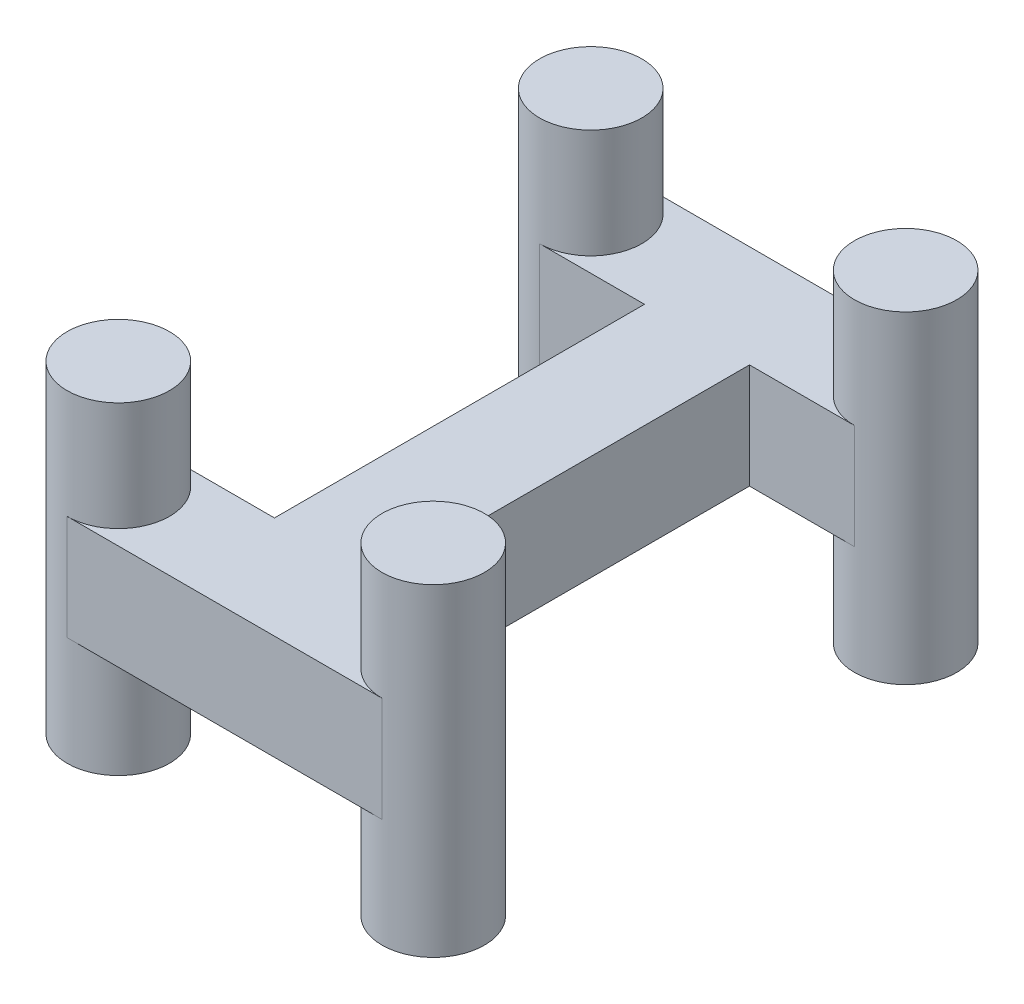
ISO-10303-21;
HEADER;
FILE_DESCRIPTION(('STEP AP214'),'2;1');
FILE_NAME('part.step','',(''),(''),'','','');
FILE_SCHEMA(('AUTOMOTIVE_DESIGN { 1 0 10303 214 1 1 1 1 }'));
ENDSEC;
DATA;
#1=APPLICATION_CONTEXT('core data for automotive mechanical design processes');
#2=APPLICATION_PROTOCOL_DEFINITION('international standard','automotive_design',2000,#1);
#3=PRODUCT_CONTEXT('',#1,'mechanical');
#4=PRODUCT('Part','Part','',(#3));
#5=PRODUCT_RELATED_PRODUCT_CATEGORY('part','',(#4));
#6=PRODUCT_DEFINITION_FORMATION('','',#4);
#7=PRODUCT_DEFINITION_CONTEXT('part definition',#1,'design');
#8=PRODUCT_DEFINITION('design','',#6,#7);
#9=PRODUCT_DEFINITION_SHAPE('','',#8);
#10=(LENGTH_UNIT() NAMED_UNIT(*) SI_UNIT(.MILLI.,.METRE.));
#11=(NAMED_UNIT(*) PLANE_ANGLE_UNIT() SI_UNIT($,.RADIAN.));
#12=(NAMED_UNIT(*) SI_UNIT($,.STERADIAN.) SOLID_ANGLE_UNIT());
#13=UNCERTAINTY_MEASURE_WITH_UNIT(LENGTH_MEASURE(1.E-05),#10,'distance_accuracy_value','');
#14=(GEOMETRIC_REPRESENTATION_CONTEXT(3) GLOBAL_UNCERTAINTY_ASSIGNED_CONTEXT((#13)) GLOBAL_UNIT_ASSIGNED_CONTEXT((#10,
#11,#12)) REPRESENTATION_CONTEXT('',''));
#15=CARTESIAN_POINT('',(0.,0.,0.));
#16=DIRECTION('',(0.,0.,1.));
#17=DIRECTION('',(1.,0.,0.));
#18=AXIS2_PLACEMENT_3D('',#15,#16,#17);
#19=CARTESIAN_POINT('',(0.,-2.,7.05));
#20=DIRECTION('',(0.,0.,-1.));
#21=DIRECTION('',(-1.,0.,0.));
#22=AXIS2_PLACEMENT_3D('',#19,#20,#21);
#23=PLANE('',#22);
#24=DIRECTION('',(0.,1.,0.));
#25=VECTOR('',#24,1.);
#26=CARTESIAN_POINT('',(-6.,-2.,7.05));
#27=LINE('',#26,#25);
#28=CARTESIAN_POINT('',(-6.,-2.,7.05));
#29=VERTEX_POINT('',#28);
#30=CARTESIAN_POINT('',(-6.,2.,7.05));
#31=VERTEX_POINT('',#30);
#32=EDGE_CURVE('E11',#29,#31,#27,.T.);
#33=ORIENTED_EDGE('',*,*,#32,.T.);
#34=DIRECTION('',(-1.,0.,0.));
#35=VECTOR('',#34,1.);
#36=CARTESIAN_POINT('',(0.,2.,7.05));
#37=LINE('',#36,#35);
#38=CARTESIAN_POINT('',(-2.,2.,7.05));
#39=VERTEX_POINT('',#38);
#40=EDGE_CURVE('E189',#39,#31,#37,.T.);
#41=ORIENTED_EDGE('',*,*,#40,.F.);
#42=DIRECTION('',(0.,1.,0.));
#43=VECTOR('',#42,1.);
#44=CARTESIAN_POINT('',(-2.,-2.,7.05));
#45=LINE('',#44,#43);
#46=CARTESIAN_POINT('',(-2.,-2.,7.05));
#47=VERTEX_POINT('',#46);
#48=EDGE_CURVE('E51',#47,#39,#45,.T.);
#49=ORIENTED_EDGE('',*,*,#48,.F.);
#50=DIRECTION('',(-1.,0.,0.));
#51=VECTOR('',#50,1.);
#52=CARTESIAN_POINT('',(0.,-2.,7.05));
#53=LINE('',#52,#51);
#54=EDGE_CURVE('E228',#47,#29,#53,.T.);
#55=ORIENTED_EDGE('',*,*,#54,.T.);
#56=EDGE_LOOP('',(#33,#41,#49,#55));
#57=FACE_BOUND('',#56,.T.);
#58=ADVANCED_FACE('F41',(#57),#23,.T.);
#59=CARTESIAN_POINT('',(-2.,-2.,0.));
#60=DIRECTION('',(-1.,0.,0.));
#61=DIRECTION('',(0.,0.,1.));
#62=AXIS2_PLACEMENT_3D('',#59,#60,#61);
#63=PLANE('',#62);
#64=ORIENTED_EDGE('',*,*,#48,.T.);
#65=DIRECTION('',(0.,0.,1.));
#66=VECTOR('',#65,1.);
#67=CARTESIAN_POINT('',(-2.,2.,0.));
#68=LINE('',#67,#66);
#69=CARTESIAN_POINT('',(-2.,2.,-7.05));
#70=VERTEX_POINT('',#69);
#71=EDGE_CURVE('E185',#70,#39,#68,.T.);
#72=ORIENTED_EDGE('',*,*,#71,.F.);
#73=DIRECTION('',(0.,1.,0.));
#74=VECTOR('',#73,1.);
#75=CARTESIAN_POINT('',(-2.,-2.,-7.05));
#76=LINE('',#75,#74);
#77=CARTESIAN_POINT('',(-2.,-2.,-7.05));
#78=VERTEX_POINT('',#77);
#79=EDGE_CURVE('E233',#78,#70,#76,.T.);
#80=ORIENTED_EDGE('',*,*,#79,.F.);
#81=DIRECTION('',(0.,0.,1.));
#82=VECTOR('',#81,1.);
#83=CARTESIAN_POINT('',(-2.,-2.,0.));
#84=LINE('',#83,#82);
#85=EDGE_CURVE('E225',#78,#47,#84,.T.);
#86=ORIENTED_EDGE('',*,*,#85,.T.);
#87=EDGE_LOOP('',(#64,#72,#80,#86));
#88=FACE_BOUND('',#87,.T.);
#89=ADVANCED_FACE('F293',(#88),#63,.T.);
#90=CARTESIAN_POINT('',(0.,-2.,-7.05));
#91=DIRECTION('',(0.,0.,1.));
#92=DIRECTION('',(1.,0.,0.));
#93=AXIS2_PLACEMENT_3D('',#90,#91,#92);
#94=PLANE('',#93);
#95=ORIENTED_EDGE('',*,*,#79,.T.);
#96=DIRECTION('',(1.,0.,0.));
#97=VECTOR('',#96,1.);
#98=CARTESIAN_POINT('',(0.,2.,-7.05));
#99=LINE('',#98,#97);
#100=CARTESIAN_POINT('',(-6.,2.,-7.05));
#101=VERTEX_POINT('',#100);
#102=EDGE_CURVE('E181',#101,#70,#99,.T.);
#103=ORIENTED_EDGE('',*,*,#102,.F.);
#104=DIRECTION('',(0.,1.,0.));
#105=VECTOR('',#104,1.);
#106=CARTESIAN_POINT('',(-6.,-2.,-7.05));
#107=LINE('',#106,#105);
#108=CARTESIAN_POINT('',(-6.,-2.,-7.05));
#109=VERTEX_POINT('',#108);
#110=EDGE_CURVE('E236',#109,#101,#107,.T.);
#111=ORIENTED_EDGE('',*,*,#110,.F.);
#112=DIRECTION('',(1.,0.,0.));
#113=VECTOR('',#112,1.);
#114=CARTESIAN_POINT('',(0.,-2.,-7.05));
#115=LINE('',#114,#113);
#116=EDGE_CURVE('E221',#109,#78,#115,.T.);
#117=ORIENTED_EDGE('',*,*,#116,.T.);
#118=EDGE_LOOP('',(#95,#103,#111,#117));
#119=FACE_BOUND('',#118,.T.);
#120=ADVANCED_FACE('F290',(#119),#94,.T.);
#121=CARTESIAN_POINT('',(0.,-2.,-10.95));
#122=DIRECTION('',(0.,0.,-1.));
#123=DIRECTION('',(-1.,0.,0.));
#124=AXIS2_PLACEMENT_3D('',#121,#122,#123);
#125=PLANE('',#124);
#126=DIRECTION('',(0.,1.,0.));
#127=VECTOR('',#126,1.);
#128=CARTESIAN_POINT('',(-6.,-2.,-10.95));
#129=LINE('',#128,#127);
#130=CARTESIAN_POINT('',(-6.,-2.,-10.95));
#131=VERTEX_POINT('',#130);
#132=CARTESIAN_POINT('',(-6.,2.,-10.95));
#133=VERTEX_POINT('',#132);
#134=EDGE_CURVE('E240',#131,#133,#129,.T.);
#135=ORIENTED_EDGE('',*,*,#134,.T.);
#136=DIRECTION('',(-1.,0.,0.));
#137=VECTOR('',#136,1.);
#138=CARTESIAN_POINT('',(0.,2.,-10.95));
#139=LINE('',#138,#137);
#140=CARTESIAN_POINT('',(6.,2.,-10.95));
#141=VERTEX_POINT('',#140);
#142=EDGE_CURVE('E174',#141,#133,#139,.T.);
#143=ORIENTED_EDGE('',*,*,#142,.F.);
#144=DIRECTION('',(0.,1.,0.));
#145=VECTOR('',#144,1.);
#146=CARTESIAN_POINT('',(6.,-2.,-10.95));
#147=LINE('',#146,#145);
#148=CARTESIAN_POINT('',(6.,-2.,-10.95));
#149=VERTEX_POINT('',#148);
#150=EDGE_CURVE('E244',#149,#141,#147,.T.);
#151=ORIENTED_EDGE('',*,*,#150,.F.);
#152=DIRECTION('',(-1.,0.,0.));
#153=VECTOR('',#152,1.);
#154=CARTESIAN_POINT('',(0.,-2.,-10.95));
#155=LINE('',#154,#153);
#156=EDGE_CURVE('E214',#149,#131,#155,.T.);
#157=ORIENTED_EDGE('',*,*,#156,.T.);
#158=EDGE_LOOP('',(#135,#143,#151,#157));
#159=FACE_BOUND('',#158,.T.);
#160=ADVANCED_FACE('F284',(#159),#125,.T.);
#161=CARTESIAN_POINT('',(0.,-2.,-7.05));
#162=DIRECTION('',(0.,0.,1.));
#163=DIRECTION('',(1.,0.,0.));
#164=AXIS2_PLACEMENT_3D('',#161,#162,#163);
#165=PLANE('',#164);
#166=DIRECTION('',(0.,1.,0.));
#167=VECTOR('',#166,1.);
#168=CARTESIAN_POINT('',(6.,-2.,-7.05));
#169=LINE('',#168,#167);
#170=CARTESIAN_POINT('',(6.,-2.,-7.05));
#171=VERTEX_POINT('',#170);
#172=CARTESIAN_POINT('',(6.,2.,-7.05));
#173=VERTEX_POINT('',#172);
#174=EDGE_CURVE('E248',#171,#173,#169,.T.);
#175=ORIENTED_EDGE('',*,*,#174,.T.);
#176=DIRECTION('',(1.,0.,0.));
#177=VECTOR('',#176,1.);
#178=CARTESIAN_POINT('',(0.,2.,-7.05));
#179=LINE('',#178,#177);
#180=CARTESIAN_POINT('',(2.,2.,-7.05));
#181=VERTEX_POINT('',#180);
#182=EDGE_CURVE('E167',#181,#173,#179,.T.);
#183=ORIENTED_EDGE('',*,*,#182,.F.);
#184=DIRECTION('',(0.,1.,0.));
#185=VECTOR('',#184,1.);
#186=CARTESIAN_POINT('',(2.,-2.,-7.05));
#187=LINE('',#186,#185);
#188=CARTESIAN_POINT('',(2.,-2.,-7.05));
#189=VERTEX_POINT('',#188);
#190=EDGE_CURVE('E252',#189,#181,#187,.T.);
#191=ORIENTED_EDGE('',*,*,#190,.F.);
#192=DIRECTION('',(1.,0.,0.));
#193=VECTOR('',#192,1.);
#194=CARTESIAN_POINT('',(0.,-2.,-7.05));
#195=LINE('',#194,#193);
#196=EDGE_CURVE('E207',#189,#171,#195,.T.);
#197=ORIENTED_EDGE('',*,*,#196,.T.);
#198=EDGE_LOOP('',(#175,#183,#191,#197));
#199=FACE_BOUND('',#198,.T.);
#200=ADVANCED_FACE('F274',(#199),#165,.T.);
#201=CARTESIAN_POINT('',(2.,-2.,0.));
#202=DIRECTION('',(1.,0.,0.));
#203=DIRECTION('',(0.,0.,-1.));
#204=AXIS2_PLACEMENT_3D('',#201,#202,#203);
#205=PLANE('',#204);
#206=ORIENTED_EDGE('',*,*,#190,.T.);
#207=DIRECTION('',(0.,0.,-1.));
#208=VECTOR('',#207,1.);
#209=CARTESIAN_POINT('',(2.,2.,0.));
#210=LINE('',#209,#208);
#211=CARTESIAN_POINT('',(2.,2.,7.05));
#212=VERTEX_POINT('',#211);
#213=EDGE_CURVE('E160',#212,#181,#210,.T.);
#214=ORIENTED_EDGE('',*,*,#213,.F.);
#215=DIRECTION('',(0.,1.,0.));
#216=VECTOR('',#215,1.);
#217=CARTESIAN_POINT('',(2.,-2.,7.05));
#218=LINE('',#217,#216);
#219=CARTESIAN_POINT('',(2.,-2.,7.05));
#220=VERTEX_POINT('',#219);
#221=EDGE_CURVE('E255',#220,#212,#218,.T.);
#222=ORIENTED_EDGE('',*,*,#221,.F.);
#223=DIRECTION('',(0.,0.,-1.));
#224=VECTOR('',#223,1.);
#225=CARTESIAN_POINT('',(2.,-2.,0.));
#226=LINE('',#225,#224);
#227=EDGE_CURVE('E203',#220,#189,#226,.T.);
#228=ORIENTED_EDGE('',*,*,#227,.T.);
#229=EDGE_LOOP('',(#206,#214,#222,#228));
#230=FACE_BOUND('',#229,.T.);
#231=ADVANCED_FACE('F272',(#230),#205,.T.);
#232=CARTESIAN_POINT('',(0.,-2.,7.05));
#233=DIRECTION('',(0.,0.,-1.));
#234=DIRECTION('',(-1.,0.,0.));
#235=AXIS2_PLACEMENT_3D('',#232,#233,#234);
#236=PLANE('',#235);
#237=ORIENTED_EDGE('',*,*,#221,.T.);
#238=DIRECTION('',(-1.,0.,0.));
#239=VECTOR('',#238,1.);
#240=CARTESIAN_POINT('',(0.,2.,7.05));
#241=LINE('',#240,#239);
#242=CARTESIAN_POINT('',(6.,2.,7.05));
#243=VERTEX_POINT('',#242);
#244=EDGE_CURVE('E157',#243,#212,#241,.T.);
#245=ORIENTED_EDGE('',*,*,#244,.F.);
#246=DIRECTION('',(0.,1.,0.));
#247=VECTOR('',#246,1.);
#248=CARTESIAN_POINT('',(6.,-2.,7.05));
#249=LINE('',#248,#247);
#250=CARTESIAN_POINT('',(6.,-2.,7.05));
#251=VERTEX_POINT('',#250);
#252=EDGE_CURVE('E154',#251,#243,#249,.T.);
#253=ORIENTED_EDGE('',*,*,#252,.F.);
#254=DIRECTION('',(-1.,0.,0.));
#255=VECTOR('',#254,1.);
#256=CARTESIAN_POINT('',(0.,-2.,7.05));
#257=LINE('',#256,#255);
#258=EDGE_CURVE('E199',#251,#220,#257,.T.);
#259=ORIENTED_EDGE('',*,*,#258,.T.);
#260=EDGE_LOOP('',(#237,#245,#253,#259));
#261=FACE_BOUND('',#260,.T.);
#262=ADVANCED_FACE('F268',(#261),#236,.T.);
#263=CARTESIAN_POINT('',(0.,-2.,10.95));
#264=DIRECTION('',(0.,0.,1.));
#265=DIRECTION('',(1.,0.,0.));
#266=AXIS2_PLACEMENT_3D('',#263,#264,#265);
#267=PLANE('',#266);
#268=DIRECTION('',(0.,1.,0.));
#269=VECTOR('',#268,1.);
#270=CARTESIAN_POINT('',(6.,-2.,10.95));
#271=LINE('',#270,#269);
#272=CARTESIAN_POINT('',(6.,-2.,10.95));
#273=VERTEX_POINT('',#272);
#274=CARTESIAN_POINT('',(6.,2.,10.95));
#275=VERTEX_POINT('',#274);
#276=EDGE_CURVE('E149',#273,#275,#271,.T.);
#277=ORIENTED_EDGE('',*,*,#276,.T.);
#278=DIRECTION('',(1.,0.,0.));
#279=VECTOR('',#278,1.);
#280=CARTESIAN_POINT('',(0.,2.,10.95));
#281=LINE('',#280,#279);
#282=CARTESIAN_POINT('',(-6.,2.,10.95));
#283=VERTEX_POINT('',#282);
#284=EDGE_CURVE('E134',#283,#275,#281,.T.);
#285=ORIENTED_EDGE('',*,*,#284,.F.);
#286=DIRECTION('',(0.,1.,0.));
#287=VECTOR('',#286,1.);
#288=CARTESIAN_POINT('',(-6.,-2.,10.95));
#289=LINE('',#288,#287);
#290=CARTESIAN_POINT('',(-6.,-2.,10.95));
#291=VERTEX_POINT('',#290);
#292=EDGE_CURVE('E45',#291,#283,#289,.T.);
#293=ORIENTED_EDGE('',*,*,#292,.F.);
#294=DIRECTION('',(1.,0.,0.));
#295=VECTOR('',#294,1.);
#296=CARTESIAN_POINT('',(0.,-2.,10.95));
#297=LINE('',#296,#295);
#298=EDGE_CURVE('E150',#291,#273,#297,.T.);
#299=ORIENTED_EDGE('',*,*,#298,.T.);
#300=EDGE_LOOP('',(#277,#285,#293,#299));
#301=FACE_BOUND('',#300,.T.);
#302=ADVANCED_FACE('F43',(#301),#267,.T.);
#303=CARTESIAN_POINT('',(0.,-2.,0.));
#304=DIRECTION('',(0.,1.,0.));
#305=DIRECTION('',(0.,0.,1.));
#306=AXIS2_PLACEMENT_3D('',#303,#304,#305);
#307=PLANE('',#306);
#308=CARTESIAN_POINT('',(-6.,-2.,9.));
#309=DIRECTION('',(0.,1.,0.));
#310=DIRECTION('',(0.,0.,1.));
#311=AXIS2_PLACEMENT_3D('',#308,#309,#310);
#312=CIRCLE('',#311,1.95);
#313=EDGE_CURVE('E59',#291,#29,#312,.T.);
#314=ORIENTED_EDGE('',*,*,#313,.T.);
#315=ORIENTED_EDGE('',*,*,#54,.F.);
#316=ORIENTED_EDGE('',*,*,#85,.F.);
#317=ORIENTED_EDGE('',*,*,#116,.F.);
#318=CARTESIAN_POINT('',(-6.,-2.,-9.));
#319=DIRECTION('',(0.,1.,0.));
#320=DIRECTION('',(0.,0.,1.));
#321=AXIS2_PLACEMENT_3D('',#318,#319,#320);
#322=CIRCLE('',#321,1.95);
#323=EDGE_CURVE('E218',#109,#131,#322,.T.);
#324=ORIENTED_EDGE('',*,*,#323,.T.);
#325=ORIENTED_EDGE('',*,*,#156,.F.);
#326=CARTESIAN_POINT('',(6.,-2.,-9.));
#327=DIRECTION('',(0.,1.,0.));
#328=DIRECTION('',(0.,0.,1.));
#329=AXIS2_PLACEMENT_3D('',#326,#327,#328);
#330=CIRCLE('',#329,1.95);
#331=EDGE_CURVE('E211',#149,#171,#330,.T.);
#332=ORIENTED_EDGE('',*,*,#331,.T.);
#333=ORIENTED_EDGE('',*,*,#196,.F.);
#334=ORIENTED_EDGE('',*,*,#227,.F.);
#335=ORIENTED_EDGE('',*,*,#258,.F.);
#336=CARTESIAN_POINT('',(6.,-2.,9.));
#337=DIRECTION('',(0.,1.,0.));
#338=DIRECTION('',(0.,0.,1.));
#339=AXIS2_PLACEMENT_3D('',#336,#337,#338);
#340=CIRCLE('',#339,1.95);
#341=EDGE_CURVE('E196',#251,#273,#340,.T.);
#342=ORIENTED_EDGE('',*,*,#341,.T.);
#343=ORIENTED_EDGE('',*,*,#298,.F.);
#344=EDGE_LOOP('',(#314,#315,#316,#317,#324,#325,#332,#333,#334,#335,#342,#343));
#345=FACE_BOUND('',#344,.T.);
#346=ADVANCED_FACE('F263',(#345),#307,.F.);
#347=CARTESIAN_POINT('',(0.,2.,0.));
#348=DIRECTION('',(0.,1.,0.));
#349=DIRECTION('',(0.,0.,1.));
#350=AXIS2_PLACEMENT_3D('',#347,#348,#349);
#351=PLANE('',#350);
#352=CARTESIAN_POINT('',(-6.,2.,9.));
#353=DIRECTION('',(0.,1.,0.));
#354=DIRECTION('',(0.,0.,1.));
#355=AXIS2_PLACEMENT_3D('',#352,#353,#354);
#356=CIRCLE('',#355,1.95);
#357=EDGE_CURVE('E142',#283,#31,#356,.T.);
#358=ORIENTED_EDGE('',*,*,#357,.F.);
#359=ORIENTED_EDGE('',*,*,#284,.T.);
#360=CARTESIAN_POINT('',(6.,2.,9.));
#361=DIRECTION('',(0.,1.,0.));
#362=DIRECTION('',(0.,0.,1.));
#363=AXIS2_PLACEMENT_3D('',#360,#361,#362);
#364=CIRCLE('',#363,1.95);
#365=EDGE_CURVE('E139',#243,#275,#364,.T.);
#366=ORIENTED_EDGE('',*,*,#365,.F.);
#367=ORIENTED_EDGE('',*,*,#244,.T.);
#368=ORIENTED_EDGE('',*,*,#213,.T.);
#369=ORIENTED_EDGE('',*,*,#182,.T.);
#370=CARTESIAN_POINT('',(6.,2.,-9.));
#371=DIRECTION('',(0.,1.,0.));
#372=DIRECTION('',(0.,0.,1.));
#373=AXIS2_PLACEMENT_3D('',#370,#371,#372);
#374=CIRCLE('',#373,1.95);
#375=EDGE_CURVE('E170',#141,#173,#374,.T.);
#376=ORIENTED_EDGE('',*,*,#375,.F.);
#377=ORIENTED_EDGE('',*,*,#142,.T.);
#378=CARTESIAN_POINT('',(-6.,2.,-9.));
#379=DIRECTION('',(0.,1.,0.));
#380=DIRECTION('',(0.,0.,1.));
#381=AXIS2_PLACEMENT_3D('',#378,#379,#380);
#382=CIRCLE('',#381,1.95);
#383=EDGE_CURVE('E177',#101,#133,#382,.T.);
#384=ORIENTED_EDGE('',*,*,#383,.F.);
#385=ORIENTED_EDGE('',*,*,#102,.T.);
#386=ORIENTED_EDGE('',*,*,#71,.T.);
#387=ORIENTED_EDGE('',*,*,#40,.T.);
#388=EDGE_LOOP('',(#358,#359,#366,#367,#368,#369,#376,#377,#384,#385,#386,#387));
#389=FACE_BOUND('',#388,.T.);
#390=ADVANCED_FACE('F136',(#389),#351,.T.);
#391=CARTESIAN_POINT('',(-6.,-6.15,-9.));
#392=DIRECTION('',(0.,1.,0.));
#393=DIRECTION('',(0.,0.,1.));
#394=AXIS2_PLACEMENT_3D('',#391,#392,#393);
#395=CYLINDRICAL_SURFACE('',#394,1.95);
#396=CARTESIAN_POINT('',(-6.,6.15,-9.));
#397=DIRECTION('',(0.,1.,0.));
#398=DIRECTION('',(0.,0.,1.));
#399=AXIS2_PLACEMENT_3D('',#396,#397,#398);
#400=CIRCLE('',#399,1.95);
#401=CARTESIAN_POINT('',(-6.,6.15,-7.05));
#402=VERTEX_POINT('',#401);
#403=EDGE_CURVE('E395',#402,#402,#400,.T.);
#404=ORIENTED_EDGE('',*,*,#403,.F.);
#405=EDGE_LOOP('',(#404));
#406=FACE_BOUND('',#405,.T.);
#407=CARTESIAN_POINT('',(-6.,-6.15,-9.));
#408=DIRECTION('',(0.,1.,0.));
#409=DIRECTION('',(0.,0.,1.));
#410=AXIS2_PLACEMENT_3D('',#407,#408,#409);
#411=CIRCLE('',#410,1.95);
#412=CARTESIAN_POINT('',(-6.,-6.15,-7.05));
#413=VERTEX_POINT('',#412);
#414=EDGE_CURVE('E399',#413,#413,#411,.T.);
#415=ORIENTED_EDGE('',*,*,#414,.T.);
#416=EDGE_LOOP('',(#415));
#417=FACE_BOUND('',#416,.T.);
#418=ORIENTED_EDGE('',*,*,#323,.F.);
#419=ORIENTED_EDGE('',*,*,#110,.T.);
#420=ORIENTED_EDGE('',*,*,#383,.T.);
#421=ORIENTED_EDGE('',*,*,#134,.F.);
#422=EDGE_LOOP('',(#418,#419,#420,#421));
#423=FACE_BOUND('',#422,.T.);
#424=ADVANCED_FACE('F287',(#406,#417,#423),#395,.T.);
#425=CARTESIAN_POINT('',(0.,-6.15,0.));
#426=DIRECTION('',(0.,1.,0.));
#427=DIRECTION('',(0.,0.,1.));
#428=AXIS2_PLACEMENT_3D('',#425,#426,#427);
#429=PLANE('',#428);
#430=ORIENTED_EDGE('',*,*,#414,.F.);
#431=EDGE_LOOP('',(#430));
#432=FACE_BOUND('',#431,.T.);
#433=ADVANCED_FACE('F324',(#432),#429,.F.);
#434=CARTESIAN_POINT('',(0.,6.15,0.));
#435=DIRECTION('',(0.,1.,0.));
#436=DIRECTION('',(0.,0.,1.));
#437=AXIS2_PLACEMENT_3D('',#434,#435,#436);
#438=PLANE('',#437);
#439=ORIENTED_EDGE('',*,*,#403,.T.);
#440=EDGE_LOOP('',(#439));
#441=FACE_BOUND('',#440,.T.);
#442=ADVANCED_FACE('F330',(#441),#438,.T.);
#443=CARTESIAN_POINT('',(6.,-6.15,-9.));
#444=DIRECTION('',(0.,1.,0.));
#445=DIRECTION('',(0.,0.,1.));
#446=AXIS2_PLACEMENT_3D('',#443,#444,#445);
#447=CYLINDRICAL_SURFACE('',#446,1.95);
#448=CARTESIAN_POINT('',(6.,6.15,-9.));
#449=DIRECTION('',(0.,1.,0.));
#450=DIRECTION('',(0.,0.,1.));
#451=AXIS2_PLACEMENT_3D('',#448,#449,#450);
#452=CIRCLE('',#451,1.95);
#453=CARTESIAN_POINT('',(6.,6.15,-7.05));
#454=VERTEX_POINT('',#453);
#455=EDGE_CURVE('E387',#454,#454,#452,.T.);
#456=ORIENTED_EDGE('',*,*,#455,.F.);
#457=EDGE_LOOP('',(#456));
#458=FACE_BOUND('',#457,.T.);
#459=CARTESIAN_POINT('',(6.,-6.15,-9.));
#460=DIRECTION('',(0.,1.,0.));
#461=DIRECTION('',(0.,0.,1.));
#462=AXIS2_PLACEMENT_3D('',#459,#460,#461);
#463=CIRCLE('',#462,1.95);
#464=CARTESIAN_POINT('',(6.,-6.15,-7.05));
#465=VERTEX_POINT('',#464);
#466=EDGE_CURVE('E391',#465,#465,#463,.T.);
#467=ORIENTED_EDGE('',*,*,#466,.T.);
#468=EDGE_LOOP('',(#467));
#469=FACE_BOUND('',#468,.T.);
#470=ORIENTED_EDGE('',*,*,#331,.F.);
#471=ORIENTED_EDGE('',*,*,#150,.T.);
#472=ORIENTED_EDGE('',*,*,#375,.T.);
#473=ORIENTED_EDGE('',*,*,#174,.F.);
#474=EDGE_LOOP('',(#470,#471,#472,#473));
#475=FACE_BOUND('',#474,.T.);
#476=ADVANCED_FACE('F279',(#458,#469,#475),#447,.T.);
#477=CARTESIAN_POINT('',(0.,-6.15,0.));
#478=DIRECTION('',(0.,1.,0.));
#479=DIRECTION('',(0.,0.,1.));
#480=AXIS2_PLACEMENT_3D('',#477,#478,#479);
#481=PLANE('',#480);
#482=ORIENTED_EDGE('',*,*,#466,.F.);
#483=EDGE_LOOP('',(#482));
#484=FACE_BOUND('',#483,.T.);
#485=ADVANCED_FACE('F337',(#484),#481,.F.);
#486=CARTESIAN_POINT('',(0.,6.15,0.));
#487=DIRECTION('',(0.,1.,0.));
#488=DIRECTION('',(0.,0.,1.));
#489=AXIS2_PLACEMENT_3D('',#486,#487,#488);
#490=PLANE('',#489);
#491=ORIENTED_EDGE('',*,*,#455,.T.);
#492=EDGE_LOOP('',(#491));
#493=FACE_BOUND('',#492,.T.);
#494=ADVANCED_FACE('F341',(#493),#490,.T.);
#495=CARTESIAN_POINT('',(-6.,-6.15,9.));
#496=DIRECTION('',(0.,1.,0.));
#497=DIRECTION('',(0.,0.,1.));
#498=AXIS2_PLACEMENT_3D('',#495,#496,#497);
#499=CYLINDRICAL_SURFACE('',#498,1.95);
#500=CARTESIAN_POINT('',(-6.,6.15,9.));
#501=DIRECTION('',(0.,1.,0.));
#502=DIRECTION('',(0.,0.,1.));
#503=AXIS2_PLACEMENT_3D('',#500,#501,#502);
#504=CIRCLE('',#503,1.95);
#505=CARTESIAN_POINT('',(-6.,6.15,10.95));
#506=VERTEX_POINT('',#505);
#507=EDGE_CURVE('E377',#506,#506,#504,.T.);
#508=ORIENTED_EDGE('',*,*,#507,.F.);
#509=EDGE_LOOP('',(#508));
#510=FACE_BOUND('',#509,.T.);
#511=CARTESIAN_POINT('',(-6.,-6.15,9.));
#512=DIRECTION('',(0.,1.,0.));
#513=DIRECTION('',(0.,0.,1.));
#514=AXIS2_PLACEMENT_3D('',#511,#512,#513);
#515=CIRCLE('',#514,1.95);
#516=CARTESIAN_POINT('',(-6.,-6.15,10.95));
#517=VERTEX_POINT('',#516);
#518=EDGE_CURVE('E383',#517,#517,#515,.T.);
#519=ORIENTED_EDGE('',*,*,#518,.T.);
#520=EDGE_LOOP('',(#519));
#521=FACE_BOUND('',#520,.T.);
#522=ORIENTED_EDGE('',*,*,#313,.F.);
#523=ORIENTED_EDGE('',*,*,#292,.T.);
#524=ORIENTED_EDGE('',*,*,#357,.T.);
#525=ORIENTED_EDGE('',*,*,#32,.F.);
#526=EDGE_LOOP('',(#522,#523,#524,#525));
#527=FACE_BOUND('',#526,.T.);
#528=ADVANCED_FACE('F261',(#510,#521,#527),#499,.T.);
#529=CARTESIAN_POINT('',(0.,-6.15,0.));
#530=DIRECTION('',(0.,1.,0.));
#531=DIRECTION('',(0.,0.,1.));
#532=AXIS2_PLACEMENT_3D('',#529,#530,#531);
#533=PLANE('',#532);
#534=ORIENTED_EDGE('',*,*,#518,.F.);
#535=EDGE_LOOP('',(#534));
#536=FACE_BOUND('',#535,.T.);
#537=ADVANCED_FACE('F348',(#536),#533,.F.);
#538=CARTESIAN_POINT('',(0.,6.15,0.));
#539=DIRECTION('',(0.,1.,0.));
#540=DIRECTION('',(0.,0.,1.));
#541=AXIS2_PLACEMENT_3D('',#538,#539,#540);
#542=PLANE('',#541);
#543=ORIENTED_EDGE('',*,*,#507,.T.);
#544=EDGE_LOOP('',(#543));
#545=FACE_BOUND('',#544,.T.);
#546=ADVANCED_FACE('F352',(#545),#542,.T.);
#547=CARTESIAN_POINT('',(6.,-6.15,9.));
#548=DIRECTION('',(0.,1.,0.));
#549=DIRECTION('',(0.,0.,1.));
#550=AXIS2_PLACEMENT_3D('',#547,#548,#549);
#551=CYLINDRICAL_SURFACE('',#550,1.95);
#552=CARTESIAN_POINT('',(6.,6.15,9.));
#553=DIRECTION('',(0.,1.,0.));
#554=DIRECTION('',(0.,0.,1.));
#555=AXIS2_PLACEMENT_3D('',#552,#553,#554);
#556=CIRCLE('',#555,1.95);
#557=CARTESIAN_POINT('',(6.,6.15,10.95));
#558=VERTEX_POINT('',#557);
#559=EDGE_CURVE('E371',#558,#558,#556,.T.);
#560=ORIENTED_EDGE('',*,*,#559,.F.);
#561=EDGE_LOOP('',(#560));
#562=FACE_BOUND('',#561,.T.);
#563=CARTESIAN_POINT('',(6.,-6.15,9.));
#564=DIRECTION('',(0.,1.,0.));
#565=DIRECTION('',(0.,0.,1.));
#566=AXIS2_PLACEMENT_3D('',#563,#564,#565);
#567=CIRCLE('',#566,1.95);
#568=CARTESIAN_POINT('',(6.,-6.15,10.95));
#569=VERTEX_POINT('',#568);
#570=EDGE_CURVE('E373',#569,#569,#567,.T.);
#571=ORIENTED_EDGE('',*,*,#570,.T.);
#572=EDGE_LOOP('',(#571));
#573=FACE_BOUND('',#572,.T.);
#574=ORIENTED_EDGE('',*,*,#341,.F.);
#575=ORIENTED_EDGE('',*,*,#252,.T.);
#576=ORIENTED_EDGE('',*,*,#365,.T.);
#577=ORIENTED_EDGE('',*,*,#276,.F.);
#578=EDGE_LOOP('',(#574,#575,#576,#577));
#579=FACE_BOUND('',#578,.T.);
#580=ADVANCED_FACE('F155',(#562,#573,#579),#551,.T.);
#581=CARTESIAN_POINT('',(0.,-6.15,0.));
#582=DIRECTION('',(0.,1.,0.));
#583=DIRECTION('',(0.,0.,1.));
#584=AXIS2_PLACEMENT_3D('',#581,#582,#583);
#585=PLANE('',#584);
#586=ORIENTED_EDGE('',*,*,#570,.F.);
#587=EDGE_LOOP('',(#586));
#588=FACE_BOUND('',#587,.T.);
#589=ADVANCED_FACE('F359',(#588),#585,.F.);
#590=CARTESIAN_POINT('',(0.,6.15,0.));
#591=DIRECTION('',(0.,1.,0.));
#592=DIRECTION('',(0.,0.,1.));
#593=AXIS2_PLACEMENT_3D('',#590,#591,#592);
#594=PLANE('',#593);
#595=ORIENTED_EDGE('',*,*,#559,.T.);
#596=EDGE_LOOP('',(#595));
#597=FACE_BOUND('',#596,.T.);
#598=ADVANCED_FACE('F363',(#597),#594,.T.);
#599=CLOSED_SHELL('',(#58,#89,#120,#160,#200,#231,#262,#302,#346,#390,#424,#433,#442,#476,#485,
#494,#528,#537,#546,#580,#589,#598));
#600=MANIFOLD_SOLID_BREP('B2',#599);
#601=ADVANCED_BREP_SHAPE_REPRESENTATION('',(#18,#600),#14);
#602=SHAPE_DEFINITION_REPRESENTATION(#9,#601);
ENDSEC;
END-ISO-10303-21;
